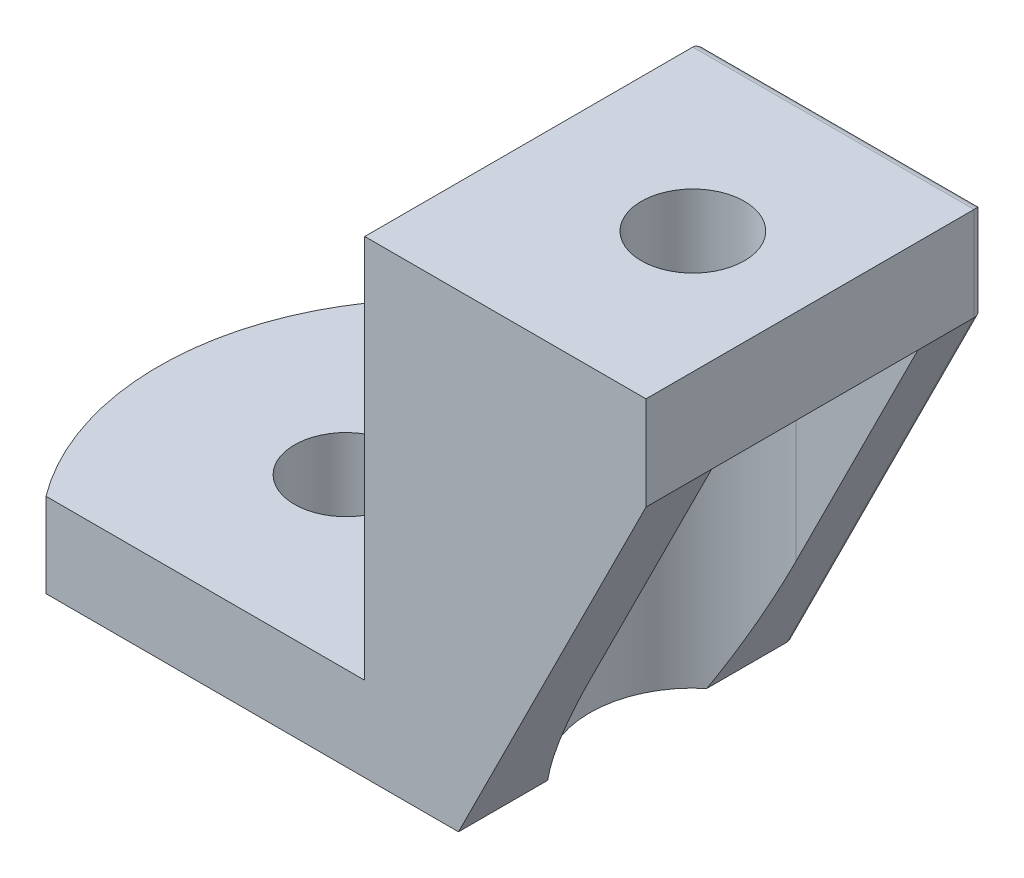
ISO-10303-21;
HEADER;
FILE_DESCRIPTION(('STEP AP214'),'2;1');
FILE_NAME('part.step','',(''),(''),'','','');
FILE_SCHEMA(('AUTOMOTIVE_DESIGN { 1 0 10303 214 1 1 1 1 }'));
ENDSEC;
DATA;
#1=APPLICATION_CONTEXT('core data for automotive mechanical design processes');
#2=APPLICATION_PROTOCOL_DEFINITION('international standard','automotive_design',2000,#1);
#3=PRODUCT_CONTEXT('',#1,'mechanical');
#4=PRODUCT('Part','Part','',(#3));
#5=PRODUCT_RELATED_PRODUCT_CATEGORY('part','',(#4));
#6=PRODUCT_DEFINITION_FORMATION('','',#4);
#7=PRODUCT_DEFINITION_CONTEXT('part definition',#1,'design');
#8=PRODUCT_DEFINITION('design','',#6,#7);
#9=PRODUCT_DEFINITION_SHAPE('','',#8);
#10=(LENGTH_UNIT() NAMED_UNIT(*) SI_UNIT(.MILLI.,.METRE.));
#11=(NAMED_UNIT(*) PLANE_ANGLE_UNIT() SI_UNIT($,.RADIAN.));
#12=(NAMED_UNIT(*) SI_UNIT($,.STERADIAN.) SOLID_ANGLE_UNIT());
#13=UNCERTAINTY_MEASURE_WITH_UNIT(LENGTH_MEASURE(1.E-05),#10,'distance_accuracy_value','');
#14=(GEOMETRIC_REPRESENTATION_CONTEXT(3) GLOBAL_UNCERTAINTY_ASSIGNED_CONTEXT((#13)) GLOBAL_UNIT_ASSIGNED_CONTEXT((#10,
#11,#12)) REPRESENTATION_CONTEXT('',''));
#15=CARTESIAN_POINT('',(0.,0.,0.));
#16=DIRECTION('',(0.,0.,1.));
#17=DIRECTION('',(1.,0.,0.));
#18=AXIS2_PLACEMENT_3D('',#15,#16,#17);
#19=CARTESIAN_POINT('',(0.,0.,0.));
#20=DIRECTION('',(0.,-1.,0.));
#21=DIRECTION('',(-1.,0.,0.));
#22=AXIS2_PLACEMENT_3D('',#19,#20,#21);
#23=PLANE('',#22);
#24=CARTESIAN_POINT('',(-5.00000000001,0.,9.00000000001));
#25=DIRECTION('',(0.,-1.,6.66888711271147E-13));
#26=DIRECTION('',(1.,0.,0.));
#27=AXIS2_PLACEMENT_3D('',#24,#25,#26);
#28=CIRCLE('',#27,15.00000000001);
#29=CARTESIAN_POINT('',(-17.,0.,18.));
#30=VERTEX_POINT('',#29);
#31=CARTESIAN_POINT('',(-17.3592070943,0.,0.5));
#32=VERTEX_POINT('',#31);
#33=EDGE_CURVE('E197',#30,#32,#28,.T.);
#34=ORIENTED_EDGE('',*,*,#33,.F.);
#35=DIRECTION('',(-1.,1.0000001517783E-11,0.));
#36=VECTOR('',#35,1.);
#37=CARTESIAN_POINT('',(0.,0.,18.00000000001));
#38=LINE('',#37,#36);
#39=CARTESIAN_POINT('',(0.,0.,18.));
#40=VERTEX_POINT('',#39);
#41=EDGE_CURVE('E43',#40,#30,#38,.T.);
#42=ORIENTED_EDGE('',*,*,#41,.F.);
#43=DIRECTION('',(0.,0.,1.));
#44=VECTOR('',#43,1.);
#45=CARTESIAN_POINT('',(0.,0.,0.));
#46=LINE('',#45,#44);
#47=CARTESIAN_POINT('',(0.,0.,0.5));
#48=VERTEX_POINT('',#47);
#49=EDGE_CURVE('E317',#48,#40,#46,.T.);
#50=ORIENTED_EDGE('',*,*,#49,.F.);
#51=DIRECTION('',(-1.,1.0000001517783E-11,0.));
#52=VECTOR('',#51,1.);
#53=CARTESIAN_POINT('',(1.E-11,1.00001110223025E-11,0.50000000001));
#54=LINE('',#53,#52);
#55=EDGE_CURVE('E11',#48,#32,#54,.T.);
#56=ORIENTED_EDGE('',*,*,#55,.T.);
#57=EDGE_LOOP('',(#34,#42,#50,#56));
#58=FACE_BOUND('',#57,.T.);
#59=CARTESIAN_POINT('',(-10.00000000001,0.,9.00000000001));
#60=DIRECTION('',(0.,-1.,3.63658568095534E-12));
#61=DIRECTION('',(1.,0.,0.));
#62=AXIS2_PLACEMENT_3D('',#59,#60,#61);
#63=CIRCLE('',#62,2.75000000001);
#64=CARTESIAN_POINT('',(-7.25,0.,9.00000000001));
#65=VERTEX_POINT('',#64);
#66=EDGE_CURVE('E28',#65,#65,#63,.T.);
#67=ORIENTED_EDGE('',*,*,#66,.T.);
#68=EDGE_LOOP('',(#67));
#69=FACE_BOUND('',#68,.T.);
#70=ADVANCED_FACE('F17',(#58,#69),#23,.F.);
#71=CARTESIAN_POINT('',(-5.,-4.5,9.));
#72=DIRECTION('',(0.,-1.,0.));
#73=DIRECTION('',(1.,0.,0.));
#74=AXIS2_PLACEMENT_3D('',#71,#72,#73);
#75=CYLINDRICAL_SURFACE('',#74,15.);
#76=CARTESIAN_POINT('',(-5.00000000001,-4.50000000001,9.00000000001));
#77=DIRECTION('',(0.,-1.,6.66888711271147E-13));
#78=DIRECTION('',(1.,0.,0.));
#79=AXIS2_PLACEMENT_3D('',#76,#77,#78);
#80=CIRCLE('',#79,15.00000000001);
#81=CARTESIAN_POINT('',(-17.,-4.5,18.));
#82=VERTEX_POINT('',#81);
#83=CARTESIAN_POINT('',(-17.3592070943,-4.5,0.5));
#84=VERTEX_POINT('',#83);
#85=EDGE_CURVE('E218',#82,#84,#80,.T.);
#86=ORIENTED_EDGE('',*,*,#85,.F.);
#87=DIRECTION('',(0.,1.,-1.00002220445049E-11));
#88=VECTOR('',#87,1.);
#89=CARTESIAN_POINT('',(-17.00000000001,-4.50000000001,18.00000000001));
#90=LINE('',#89,#88);
#91=EDGE_CURVE('E192',#82,#30,#90,.T.);
#92=ORIENTED_EDGE('',*,*,#91,.T.);
#93=ORIENTED_EDGE('',*,*,#33,.T.);
#94=CARTESIAN_POINT('',(-17.15242081842,-0.09491930606274,0.206896551734));
#95=CARTESIAN_POINT('',(-17.17545216604,-0.07188795844802,0.238726795729));
#96=CARTESIAN_POINT('',(-17.2015156202,-0.05074090276755,0.274983152544));
#97=CARTESIAN_POINT('',(-17.23155530229,-0.03186469501301,0.317104944843));
#98=CARTESIAN_POINT('',(-17.2873544218,-0.009856424986612,0.396379890859));
#99=CARTESIAN_POINT('',(-17.31026091638,-0.003416446063638,0.429127817203));
#100=CARTESIAN_POINT('',(-17.3347654108,-3.18807745398E-09,0.464461196963));
#101=CARTESIAN_POINT('',(-17.35920709431,-1.00008326672685E-11,0.50000000001));
#102=B_SPLINE_CURVE_WITH_KNOTS('',4,(#94,#95,#96,#97,#98,#99,#100,#101),.UNSPECIFIED.,.F.,.F.,
(5,3,5),(0.,0.619917444854,1.),.UNSPECIFIED.);
#103=CARTESIAN_POINT('',(-17.15242081841,-0.09491930605274,0.206896551724));
#104=VERTEX_POINT('',#103);
#105=EDGE_CURVE('E346',#104,#32,#102,.T.);
#106=ORIENTED_EDGE('',*,*,#105,.F.);
#107=DIRECTION('',(0.,1.,-1.00002220445049E-11));
#108=VECTOR('',#107,1.);
#109=CARTESIAN_POINT('',(-17.15242081842,-4.50000000001,0.206896551734));
#110=LINE('',#109,#108);
#111=CARTESIAN_POINT('',(-17.15242081841,-4.405080693947,0.206896551724));
#112=VERTEX_POINT('',#111);
#113=EDGE_CURVE('E160',#112,#104,#110,.T.);
#114=ORIENTED_EDGE('',*,*,#113,.F.);
#115=CARTESIAN_POINT('',(-17.15242081842,-4.405080693957,0.206896551734));
#116=CARTESIAN_POINT('',(-17.17545216604,-4.428112041572,0.238726795729));
#117=CARTESIAN_POINT('',(-17.2015156202,-4.449259097252,0.274983152544));
#118=CARTESIAN_POINT('',(-17.23155530229,-4.468135305007,0.317104944843));
#119=CARTESIAN_POINT('',(-17.2873544218,-4.490143575033,0.396379890859));
#120=CARTESIAN_POINT('',(-17.31026091638,-4.496583553956,0.429127817203));
#121=CARTESIAN_POINT('',(-17.3347654108,-4.499999996832,0.464461196963));
#122=CARTESIAN_POINT('',(-17.35920709431,-4.50000000001,0.50000000001));
#123=B_SPLINE_CURVE_WITH_KNOTS('',4,(#115,#116,#117,#118,#119,#120,#121,#122),.UNSPECIFIED.,.F.,
.F.,(5,3,5),(0.,0.619917444854,1.),.UNSPECIFIED.);
#124=EDGE_CURVE('E155',#112,#84,#123,.T.);
#125=ORIENTED_EDGE('',*,*,#124,.T.);
#126=EDGE_LOOP('',(#86,#92,#93,#106,#114,#125));
#127=FACE_BOUND('',#126,.T.);
#128=ADVANCED_FACE('F683',(#127),#75,.T.);
#129=CARTESIAN_POINT('',(0.,-0.5,0.5));
#130=DIRECTION('',(-1.,0.,0.));
#131=DIRECTION('',(0.,1.,0.));
#132=AXIS2_PLACEMENT_3D('',#129,#130,#131);
#133=CYLINDRICAL_SURFACE('',#132,0.5);
#134=CARTESIAN_POINT('',(-16.74734012448,-0.50000000001,0.50000000001));
#135=DIRECTION('',(0.707106781186548,0.707106781186548,-1.4142292632694E-11));
#136=DIRECTION('',(-0.707106781186548,0.707106781186548,-1.41422926326849E-11));
#137=AXIS2_PLACEMENT_3D('',#134,#135,#136);
#138=ELLIPSE('',#137,0.707106781201142,0.50000000001);
#139=CARTESIAN_POINT('',(-16.74734012447,-0.5,0.));
#140=VERTEX_POINT('',#139);
#141=EDGE_CURVE('E174',#140,#104,#138,.T.);
#142=ORIENTED_EDGE('',*,*,#141,.T.);
#143=ORIENTED_EDGE('',*,*,#105,.T.);
#144=ORIENTED_EDGE('',*,*,#55,.F.);
#145=CARTESIAN_POINT('',(0.50000000001,-0.50000000001,0.50000000001));
#146=DIRECTION('',(-0.707106781186548,-0.707106781186548,0.));
#147=DIRECTION('',(-0.707106781186548,0.707106781186548,0.));
#148=AXIS2_PLACEMENT_3D('',#145,#146,#147);
#149=ELLIPSE('',#148,0.707106781201142,0.50000000001);
#150=CARTESIAN_POINT('',(0.5,-0.5,0.));
#151=VERTEX_POINT('',#150);
#152=EDGE_CURVE('E325',#48,#151,#149,.T.);
#153=ORIENTED_EDGE('',*,*,#152,.T.);
#154=DIRECTION('',(-1.,1.0000001517783E-11,0.));
#155=VECTOR('',#154,1.);
#156=CARTESIAN_POINT('',(-1.00000007589415E-11,-0.50000000001,-1.00001110223025E-11));
#157=LINE('',#156,#155);
#158=EDGE_CURVE('E196',#151,#140,#157,.T.);
#159=ORIENTED_EDGE('',*,*,#158,.T.);
#160=EDGE_LOOP('',(#142,#143,#144,#153,#159));
#161=FACE_BOUND('',#160,.T.);
#162=ADVANCED_FACE('F674',(#161),#133,.T.);
#163=CARTESIAN_POINT('',(0.,20.5,0.));
#164=DIRECTION('',(1.,0.,0.));
#165=DIRECTION('',(0.,1.,0.));
#166=AXIS2_PLACEMENT_3D('',#163,#164,#165);
#167=PLANE('',#166);
#168=DIRECTION('',(0.,-1.,0.));
#169=VECTOR('',#168,1.);
#170=CARTESIAN_POINT('',(-1.00001110223025E-11,20.50000000001,0.50000000001));
#171=LINE('',#170,#169);
#172=CARTESIAN_POINT('',(0.,20.5,0.5));
#173=VERTEX_POINT('',#172);
#174=EDGE_CURVE('E321',#173,#48,#171,.T.);
#175=ORIENTED_EDGE('',*,*,#174,.T.);
#176=ORIENTED_EDGE('',*,*,#49,.T.);
#177=DIRECTION('',(0.,-1.,0.));
#178=VECTOR('',#177,1.);
#179=CARTESIAN_POINT('',(0.,20.50000000001,18.00000000001));
#180=LINE('',#179,#178);
#181=CARTESIAN_POINT('',(0.,20.5,18.));
#182=VERTEX_POINT('',#181);
#183=EDGE_CURVE('E253',#182,#40,#180,.T.);
#184=ORIENTED_EDGE('',*,*,#183,.F.);
#185=DIRECTION('',(0.,0.,1.));
#186=VECTOR('',#185,1.);
#187=CARTESIAN_POINT('',(0.,20.50000000001,0.));
#188=LINE('',#187,#186);
#189=EDGE_CURVE('E362',#173,#182,#188,.T.);
#190=ORIENTED_EDGE('',*,*,#189,.F.);
#191=EDGE_LOOP('',(#175,#176,#184,#190));
#192=FACE_BOUND('',#191,.T.);
#193=ADVANCED_FACE('F422',(#192),#167,.F.);
#194=CARTESIAN_POINT('',(0.,0.,18.));
#195=DIRECTION('',(0.,0.,-1.));
#196=DIRECTION('',(0.,-1.,0.));
#197=AXIS2_PLACEMENT_3D('',#194,#195,#196);
#198=PLANE('',#197);
#199=ORIENTED_EDGE('',*,*,#91,.F.);
#200=DIRECTION('',(1.,0.,0.));
#201=VECTOR('',#200,1.);
#202=CARTESIAN_POINT('',(-20.00000000001,-4.50000000001,18.00000000001));
#203=LINE('',#202,#201);
#204=CARTESIAN_POINT('',(5.,-4.5,18.));
#205=VERTEX_POINT('',#204);
#206=EDGE_CURVE('E322',#82,#205,#203,.T.);
#207=ORIENTED_EDGE('',*,*,#206,.T.);
#208=DIRECTION('',(0.447213595503958,0.894427190997916,0.));
#209=VECTOR('',#208,1.);
#210=CARTESIAN_POINT('',(5.00000000001,-4.50000000001,18.00000000001));
#211=LINE('',#210,#209);
#212=CARTESIAN_POINT('',(15.,15.5,18.));
#213=VERTEX_POINT('',#212);
#214=EDGE_CURVE('E357',#205,#213,#211,.T.);
#215=ORIENTED_EDGE('',*,*,#214,.T.);
#216=DIRECTION('',(0.,1.,0.));
#217=VECTOR('',#216,1.);
#218=CARTESIAN_POINT('',(15.00000000001,15.50000000001,18.00000000001));
#219=LINE('',#218,#217);
#220=CARTESIAN_POINT('',(15.,20.5,18.));
#221=VERTEX_POINT('',#220);
#222=EDGE_CURVE('E360',#213,#221,#219,.T.);
#223=ORIENTED_EDGE('',*,*,#222,.T.);
#224=DIRECTION('',(-1.,0.,0.));
#225=VECTOR('',#224,1.);
#226=CARTESIAN_POINT('',(15.00000000001,20.50000000001,18.00000000001));
#227=LINE('',#226,#225);
#228=EDGE_CURVE('E369',#221,#182,#227,.T.);
#229=ORIENTED_EDGE('',*,*,#228,.T.);
#230=ORIENTED_EDGE('',*,*,#183,.T.);
#231=ORIENTED_EDGE('',*,*,#41,.T.);
#232=EDGE_LOOP('',(#199,#207,#215,#223,#229,#230,#231));
#233=FACE_BOUND('',#232,.T.);
#234=ADVANCED_FACE('F655',(#233),#198,.F.);
#235=CARTESIAN_POINT('',(-10.,-4.5,9.));
#236=DIRECTION('',(0.,-1.,0.));
#237=DIRECTION('',(1.,0.,0.));
#238=AXIS2_PLACEMENT_3D('',#235,#236,#237);
#239=CYLINDRICAL_SURFACE('',#238,2.75);
#240=ORIENTED_EDGE('',*,*,#66,.F.);
#241=EDGE_LOOP('',(#240));
#242=FACE_BOUND('',#241,.T.);
#243=CARTESIAN_POINT('',(-10.00000000001,-4.50000000001,9.00000000001));
#244=DIRECTION('',(0.,-1.,3.63658568095534E-12));
#245=DIRECTION('',(1.,0.,0.));
#246=AXIS2_PLACEMENT_3D('',#243,#244,#245);
#247=CIRCLE('',#246,2.75000000001);
#248=CARTESIAN_POINT('',(-7.25,-4.50000000001,9.00000000001));
#249=VERTEX_POINT('',#248);
#250=EDGE_CURVE('E239',#249,#249,#247,.T.);
#251=ORIENTED_EDGE('',*,*,#250,.T.);
#252=EDGE_LOOP('',(#251));
#253=FACE_BOUND('',#252,.T.);
#254=ADVANCED_FACE('F646',(#242,#253),#239,.F.);
#255=CARTESIAN_POINT('',(-20.,-4.5,0.));
#256=DIRECTION('',(0.,1.,0.));
#257=DIRECTION('',(1.,0.,0.));
#258=AXIS2_PLACEMENT_3D('',#255,#256,#257);
#259=PLANE('',#258);
#260=CARTESIAN_POINT('',(8.50000000001,-4.50000000001,9.00000000001));
#261=DIRECTION('',(0.,-1.,1.81840386278343E-12));
#262=DIRECTION('',(1.,0.,0.));
#263=AXIS2_PLACEMENT_3D('',#260,#261,#262);
#264=CIRCLE('',#263,5.50000000001);
#265=CARTESIAN_POINT('',(5.,-4.5,13.242640687119));
#266=VERTEX_POINT('',#265);
#267=CARTESIAN_POINT('',(5.000000000001,-4.5,4.75735931288));
#268=VERTEX_POINT('',#267);
#269=EDGE_CURVE('E269',#266,#268,#264,.T.);
#270=ORIENTED_EDGE('',*,*,#269,.F.);
#271=DIRECTION('',(0.,0.,1.));
#272=VECTOR('',#271,1.);
#273=CARTESIAN_POINT('',(5.00000000001,-4.50000000001,0.));
#274=LINE('',#273,#272);
#275=EDGE_CURVE('E227',#266,#205,#274,.T.);
#276=ORIENTED_EDGE('',*,*,#275,.T.);
#277=ORIENTED_EDGE('',*,*,#206,.F.);
#278=ORIENTED_EDGE('',*,*,#85,.T.);
#279=DIRECTION('',(1.,0.,0.));
#280=VECTOR('',#279,1.);
#281=CARTESIAN_POINT('',(-17.00000000001,-4.50000000001,0.50000000001));
#282=LINE('',#281,#280);
#283=CARTESIAN_POINT('',(5.,-4.5,0.5));
#284=VERTEX_POINT('',#283);
#285=EDGE_CURVE('E215',#84,#284,#282,.T.);
#286=ORIENTED_EDGE('',*,*,#285,.T.);
#287=EDGE_CURVE('E169',#284,#268,#274,.T.);
#288=ORIENTED_EDGE('',*,*,#287,.T.);
#289=EDGE_LOOP('',(#270,#276,#277,#278,#286,#288));
#290=FACE_BOUND('',#289,.T.);
#291=ORIENTED_EDGE('',*,*,#250,.F.);
#292=EDGE_LOOP('',(#291));
#293=FACE_BOUND('',#292,.T.);
#294=ADVANCED_FACE('F637',(#290,#293),#259,.F.);
#295=CARTESIAN_POINT('',(-17.,-4.,0.5));
#296=DIRECTION('',(1.,0.,0.));
#297=DIRECTION('',(0.,0.,-1.));
#298=AXIS2_PLACEMENT_3D('',#295,#296,#297);
#299=CYLINDRICAL_SURFACE('',#298,0.5);
#300=DIRECTION('',(1.,0.,0.));
#301=VECTOR('',#300,1.);
#302=CARTESIAN_POINT('',(-17.00000000001,-4.00000000001,-1.00001110223025E-11));
#303=LINE('',#302,#301);
#304=CARTESIAN_POINT('',(-16.74734012447,-4.,0.));
#305=VERTEX_POINT('',#304);
#306=CARTESIAN_POINT('',(4.690983005625,-4.,0.));
#307=VERTEX_POINT('',#306);
#308=EDGE_CURVE('E151',#305,#307,#303,.T.);
#309=ORIENTED_EDGE('',*,*,#308,.T.);
#310=CARTESIAN_POINT('',(4.690983005635,-4.00000000001,0.50000000001));
#311=DIRECTION('',(-0.850650808349183,-0.525731112123757,0.));
#312=DIRECTION('',(0.525731112123757,-0.850650808349182,0.));
#313=AXIS2_PLACEMENT_3D('',#310,#311,#312);
#314=ELLIPSE('',#313,0.587785252305764,0.50000000001);
#315=EDGE_CURVE('E159',#307,#284,#314,.T.);
#316=ORIENTED_EDGE('',*,*,#315,.T.);
#317=ORIENTED_EDGE('',*,*,#285,.F.);
#318=ORIENTED_EDGE('',*,*,#124,.F.);
#319=CARTESIAN_POINT('',(-16.74734012448,-4.00000000001,0.50000000001));
#320=DIRECTION('',(-0.707106781186548,0.707106781186548,-1.4142292632694E-11));
#321=DIRECTION('',(0.707106781186548,0.707106781186548,-1.41422926326849E-11));
#322=AXIS2_PLACEMENT_3D('',#319,#320,#321);
#323=ELLIPSE('',#322,0.707106781201142,0.50000000001);
#324=EDGE_CURVE('E148',#305,#112,#323,.T.);
#325=ORIENTED_EDGE('',*,*,#324,.F.);
#326=EDGE_LOOP('',(#309,#316,#317,#318,#325));
#327=FACE_BOUND('',#326,.T.);
#328=ADVANCED_FACE('F150',(#327),#299,.T.);
#329=CARTESIAN_POINT('',(-16.74734012447,-4.5,0.5));
#330=DIRECTION('',(0.,1.,0.));
#331=DIRECTION('',(0.,0.,-1.));
#332=AXIS2_PLACEMENT_3D('',#329,#330,#331);
#333=CYLINDRICAL_SURFACE('',#332,0.5);
#334=ORIENTED_EDGE('',*,*,#324,.T.);
#335=ORIENTED_EDGE('',*,*,#113,.T.);
#336=ORIENTED_EDGE('',*,*,#141,.F.);
#337=DIRECTION('',(0.,1.,-1.00002220445049E-11));
#338=VECTOR('',#337,1.);
#339=CARTESIAN_POINT('',(-16.74734012448,-4.50000000001,0.));
#340=LINE('',#339,#338);
#341=EDGE_CURVE('E166',#305,#140,#340,.T.);
#342=ORIENTED_EDGE('',*,*,#341,.F.);
#343=EDGE_LOOP('',(#334,#335,#336,#342));
#344=FACE_BOUND('',#343,.T.);
#345=ADVANCED_FACE('F172',(#344),#333,.T.);
#346=CARTESIAN_POINT('',(0.,0.,0.));
#347=DIRECTION('',(0.,0.,-1.));
#348=DIRECTION('',(0.,-1.,0.));
#349=AXIS2_PLACEMENT_3D('',#346,#347,#348);
#350=PLANE('',#349);
#351=ORIENTED_EDGE('',*,*,#158,.F.);
#352=DIRECTION('',(0.,-1.,0.));
#353=VECTOR('',#352,1.);
#354=CARTESIAN_POINT('',(0.50000000001,20.50000000001,-1.00001110223025E-11));
#355=LINE('',#354,#353);
#356=CARTESIAN_POINT('',(0.5,20.,0.));
#357=VERTEX_POINT('',#356);
#358=EDGE_CURVE('E176',#357,#151,#355,.T.);
#359=ORIENTED_EDGE('',*,*,#358,.F.);
#360=DIRECTION('',(-1.,0.,0.));
#361=VECTOR('',#360,1.);
#362=CARTESIAN_POINT('',(15.00000000001,20.00000000001,-1.00001110223025E-11));
#363=LINE('',#362,#361);
#364=CARTESIAN_POINT('',(14.5,20.,0.));
#365=VERTEX_POINT('',#364);
#366=EDGE_CURVE('E326',#365,#357,#363,.T.);
#367=ORIENTED_EDGE('',*,*,#366,.F.);
#368=DIRECTION('',(0.,1.,0.));
#369=VECTOR('',#368,1.);
#370=CARTESIAN_POINT('',(14.50000000001,15.50000000001,-1.00001110223025E-11));
#371=LINE('',#370,#369);
#372=CARTESIAN_POINT('',(14.5,15.61803398875,0.));
#373=VERTEX_POINT('',#372);
#374=EDGE_CURVE('E207',#373,#365,#371,.T.);
#375=ORIENTED_EDGE('',*,*,#374,.F.);
#376=DIRECTION('',(0.447213595503958,0.894427190997916,0.));
#377=VECTOR('',#376,1.);
#378=CARTESIAN_POINT('',(4.55278640451,-4.27639320226,-1.00001110223025E-11));
#379=LINE('',#378,#377);
#380=EDGE_CURVE('E168',#307,#373,#379,.T.);
#381=ORIENTED_EDGE('',*,*,#380,.F.);
#382=ORIENTED_EDGE('',*,*,#308,.F.);
#383=ORIENTED_EDGE('',*,*,#341,.T.);
#384=EDGE_LOOP('',(#351,#359,#367,#375,#381,#382,#383));
#385=FACE_BOUND('',#384,.T.);
#386=ADVANCED_FACE('F165',(#385),#350,.T.);
#387=CARTESIAN_POINT('',(0.5,20.5,0.5));
#388=DIRECTION('',(0.,-1.,0.));
#389=DIRECTION('',(0.,0.,-1.));
#390=AXIS2_PLACEMENT_3D('',#387,#388,#389);
#391=CYLINDRICAL_SURFACE('',#390,0.5);
#392=ORIENTED_EDGE('',*,*,#358,.T.);
#393=ORIENTED_EDGE('',*,*,#152,.F.);
#394=ORIENTED_EDGE('',*,*,#174,.F.);
#395=CARTESIAN_POINT('',(0.50000000001,20.00000000001,0.50000000001));
#396=DIRECTION('',(0.707106781186548,0.707106781186548,0.));
#397=DIRECTION('',(-0.707106781186548,0.707106781186548,0.));
#398=AXIS2_PLACEMENT_3D('',#395,#396,#397);
#399=ELLIPSE('',#398,0.707106781201142,0.50000000001);
#400=EDGE_CURVE('E210',#357,#173,#399,.T.);
#401=ORIENTED_EDGE('',*,*,#400,.F.);
#402=EDGE_LOOP('',(#392,#393,#394,#401));
#403=FACE_BOUND('',#402,.T.);
#404=ADVANCED_FACE('F424',(#403),#391,.T.);
#405=CARTESIAN_POINT('',(15.,20.5,0.));
#406=DIRECTION('',(0.,-1.,0.));
#407=DIRECTION('',(0.,0.,-1.));
#408=AXIS2_PLACEMENT_3D('',#405,#406,#407);
#409=PLANE('',#408);
#410=DIRECTION('',(-1.,0.,0.));
#411=VECTOR('',#410,1.);
#412=CARTESIAN_POINT('',(15.00000000001,20.50000000001,0.50000000001));
#413=LINE('',#412,#411);
#414=CARTESIAN_POINT('',(15.,20.5,0.5));
#415=VERTEX_POINT('',#414);
#416=EDGE_CURVE('E186',#415,#173,#413,.T.);
#417=ORIENTED_EDGE('',*,*,#416,.T.);
#418=ORIENTED_EDGE('',*,*,#189,.T.);
#419=ORIENTED_EDGE('',*,*,#228,.F.);
#420=DIRECTION('',(0.,0.,1.));
#421=VECTOR('',#420,1.);
#422=CARTESIAN_POINT('',(15.00000000001,20.50000000001,0.));
#423=LINE('',#422,#421);
#424=EDGE_CURVE('E267',#415,#221,#423,.T.);
#425=ORIENTED_EDGE('',*,*,#424,.F.);
#426=EDGE_LOOP('',(#417,#418,#419,#425));
#427=FACE_BOUND('',#426,.T.);
#428=CARTESIAN_POINT('',(8.50000000001,20.50000000001,9.00000000001));
#429=DIRECTION('',(3.63645687091813E-12,-1.,3.63658568096856E-12));
#430=DIRECTION('',(1.,3.6364568709049E-12,-3.63636363635041E-12));
#431=AXIS2_PLACEMENT_3D('',#428,#429,#430);
#432=CIRCLE('',#431,2.75000000001);
#433=CARTESIAN_POINT('',(11.25000000002,20.50000000002,9.));
#434=VERTEX_POINT('',#433);
#435=EDGE_CURVE('E365',#434,#434,#432,.T.);
#436=ORIENTED_EDGE('',*,*,#435,.T.);
#437=EDGE_LOOP('',(#436));
#438=FACE_BOUND('',#437,.T.);
#439=ADVANCED_FACE('F19',(#427,#438),#409,.F.);
#440=CARTESIAN_POINT('',(5.,-4.5,0.));
#441=DIRECTION('',(-0.894427190999916,0.447213595499958,0.));
#442=DIRECTION('',(0.,0.,1.));
#443=AXIS2_PLACEMENT_3D('',#440,#441,#442);
#444=PLANE('',#443);
#445=DIRECTION('',(0.447213595503958,0.894427190997916,-1.00001986025981E-11));
#446=VECTOR('',#445,1.);
#447=CARTESIAN_POINT('',(6.00000000001,-2.50000000001,14.50000000001));
#448=LINE('',#447,#446);
#449=CARTESIAN_POINT('',(8.5,2.5,14.5));
#450=VERTEX_POINT('',#449);
#451=CARTESIAN_POINT('',(15.,15.5,14.5));
#452=VERTEX_POINT('',#451);
#453=EDGE_CURVE('E190',#450,#452,#448,.T.);
#454=ORIENTED_EDGE('',*,*,#453,.T.);
#455=DIRECTION('',(0.,0.,1.));
#456=VECTOR('',#455,1.);
#457=CARTESIAN_POINT('',(15.00000000001,15.50000000001,0.));
#458=LINE('',#457,#456);
#459=EDGE_CURVE('E201',#452,#213,#458,.T.);
#460=ORIENTED_EDGE('',*,*,#459,.T.);
#461=ORIENTED_EDGE('',*,*,#214,.F.);
#462=ORIENTED_EDGE('',*,*,#275,.F.);
#463=CARTESIAN_POINT('',(8.50000000001,2.50000000001,9.00000000001));
#464=DIRECTION('',(-0.894427190999753,0.447213595500283,8.13115628179376E-13));
#465=DIRECTION('',(-0.447213595500283,-0.894427190999753,8.13363881596169E-13));
#466=AXIS2_PLACEMENT_3D('',#463,#464,#465);
#467=ELLIPSE('',#466,12.2983738762624,5.50000000001);
#468=EDGE_CURVE('E198',#266,#450,#467,.T.);
#469=ORIENTED_EDGE('',*,*,#468,.T.);
#470=EDGE_LOOP('',(#454,#460,#461,#462,#469));
#471=FACE_BOUND('',#470,.T.);
#472=ADVANCED_FACE('F580',(#471),#444,.F.);
#473=CARTESIAN_POINT('',(15.,15.5,0.));
#474=DIRECTION('',(-1.,0.,0.));
#475=DIRECTION('',(0.,0.,1.));
#476=AXIS2_PLACEMENT_3D('',#473,#474,#475);
#477=PLANE('',#476);
#478=DIRECTION('',(0.,1.,0.));
#479=VECTOR('',#478,1.);
#480=CARTESIAN_POINT('',(15.00000000001,15.50000000001,0.50000000001));
#481=LINE('',#480,#479);
#482=CARTESIAN_POINT('',(15.,15.5,0.5));
#483=VERTEX_POINT('',#482);
#484=EDGE_CURVE('E202',#483,#415,#481,.T.);
#485=ORIENTED_EDGE('',*,*,#484,.T.);
#486=ORIENTED_EDGE('',*,*,#424,.T.);
#487=ORIENTED_EDGE('',*,*,#222,.F.);
#488=ORIENTED_EDGE('',*,*,#459,.F.);
#489=CARTESIAN_POINT('',(15.,15.5,3.5));
#490=VERTEX_POINT('',#489);
#491=EDGE_CURVE('E271',#490,#452,#458,.T.);
#492=ORIENTED_EDGE('',*,*,#491,.F.);
#493=EDGE_CURVE('E259',#483,#490,#458,.T.);
#494=ORIENTED_EDGE('',*,*,#493,.F.);
#495=EDGE_LOOP('',(#485,#486,#487,#488,#492,#494));
#496=FACE_BOUND('',#495,.T.);
#497=ADVANCED_FACE('F433',(#496),#477,.F.);
#498=DIRECTION('',(0.447213595503958,0.894427190997916,-1.00001986025981E-11));
#499=VECTOR('',#498,1.);
#500=CARTESIAN_POINT('',(6.00000000001,-2.50000000001,3.50000000001));
#501=LINE('',#500,#499);
#502=CARTESIAN_POINT('',(8.5,2.5,3.5));
#503=VERTEX_POINT('',#502);
#504=EDGE_CURVE('E285',#503,#490,#501,.T.);
#505=ORIENTED_EDGE('',*,*,#504,.F.);
#506=EDGE_CURVE('E203',#503,#268,#467,.T.);
#507=ORIENTED_EDGE('',*,*,#506,.T.);
#508=ORIENTED_EDGE('',*,*,#287,.F.);
#509=DIRECTION('',(0.447213595503958,0.894427190997916,0.));
#510=VECTOR('',#509,1.);
#511=CARTESIAN_POINT('',(5.00000000001,-4.50000000001,0.50000000001));
#512=LINE('',#511,#510);
#513=EDGE_CURVE('E256',#284,#483,#512,.T.);
#514=ORIENTED_EDGE('',*,*,#513,.T.);
#515=ORIENTED_EDGE('',*,*,#493,.T.);
#516=EDGE_LOOP('',(#505,#507,#508,#514,#515));
#517=FACE_BOUND('',#516,.T.);
#518=ADVANCED_FACE('F569',(#517),#444,.F.);
#519=CARTESIAN_POINT('',(8.5,-4.5,9.));
#520=DIRECTION('',(0.,-1.,0.));
#521=DIRECTION('',(1.,0.,0.));
#522=AXIS2_PLACEMENT_3D('',#519,#520,#521);
#523=CYLINDRICAL_SURFACE('',#522,5.5);
#524=ORIENTED_EDGE('',*,*,#269,.T.);
#525=ORIENTED_EDGE('',*,*,#506,.F.);
#526=DIRECTION('',(0.,1.,-1.00002220445049E-11));
#527=VECTOR('',#526,1.);
#528=CARTESIAN_POINT('',(8.50000000001,-4.50000000001,3.50000000001));
#529=LINE('',#528,#527);
#530=CARTESIAN_POINT('',(8.5,15.5,3.5));
#531=VERTEX_POINT('',#530);
#532=EDGE_CURVE('E206',#503,#531,#529,.T.);
#533=ORIENTED_EDGE('',*,*,#532,.T.);
#534=CARTESIAN_POINT('',(8.50000000001,15.50000000001,9.00000000001));
#535=DIRECTION('',(0.,-1.,1.81840386278343E-12));
#536=DIRECTION('',(1.,0.,0.));
#537=AXIS2_PLACEMENT_3D('',#534,#535,#536);
#538=CIRCLE('',#537,5.50000000001);
#539=CARTESIAN_POINT('',(8.5,15.5,14.5));
#540=VERTEX_POINT('',#539);
#541=EDGE_CURVE('E284',#540,#531,#538,.T.);
#542=ORIENTED_EDGE('',*,*,#541,.F.);
#543=DIRECTION('',(0.,1.,-1.00002220445049E-11));
#544=VECTOR('',#543,1.);
#545=CARTESIAN_POINT('',(8.50000000001,-4.50000000001,14.50000000001));
#546=LINE('',#545,#544);
#547=EDGE_CURVE('E310',#450,#540,#546,.T.);
#548=ORIENTED_EDGE('',*,*,#547,.F.);
#549=ORIENTED_EDGE('',*,*,#468,.F.);
#550=EDGE_LOOP('',(#524,#525,#533,#542,#548,#549));
#551=FACE_BOUND('',#550,.T.);
#552=ADVANCED_FACE('F560',(#551),#523,.F.);
#553=CARTESIAN_POINT('',(4.5527864045,-4.27639320225,0.5));
#554=DIRECTION('',(0.447213595499958,0.894427190999916,0.));
#555=DIRECTION('',(0.,0.,-1.));
#556=AXIS2_PLACEMENT_3D('',#553,#554,#555);
#557=CYLINDRICAL_SURFACE('',#556,0.5);
#558=ORIENTED_EDGE('',*,*,#380,.T.);
#559=CARTESIAN_POINT('',(14.50000000001,15.61803398876,0.50000000001));
#560=DIRECTION('',(-0.229752920561043,-0.9732489894645,0.));
#561=DIRECTION('',(0.9732489894645,-0.229752920561043,0.));
#562=AXIS2_PLACEMENT_3D('',#559,#560,#561);
#563=ELLIPSE('',#562,0.51374314838503,0.50000000001);
#564=EDGE_CURVE('E21',#373,#483,#563,.T.);
#565=ORIENTED_EDGE('',*,*,#564,.T.);
#566=ORIENTED_EDGE('',*,*,#513,.F.);
#567=ORIENTED_EDGE('',*,*,#315,.F.);
#568=EDGE_LOOP('',(#558,#565,#566,#567));
#569=FACE_BOUND('',#568,.T.);
#570=ADVANCED_FACE('F439',(#569),#557,.T.);
#571=CARTESIAN_POINT('',(15.,20.,0.5));
#572=DIRECTION('',(-1.,0.,0.));
#573=DIRECTION('',(0.,0.,-1.));
#574=AXIS2_PLACEMENT_3D('',#571,#572,#573);
#575=CYLINDRICAL_SURFACE('',#574,0.5);
#576=ORIENTED_EDGE('',*,*,#366,.T.);
#577=ORIENTED_EDGE('',*,*,#400,.T.);
#578=ORIENTED_EDGE('',*,*,#416,.F.);
#579=CARTESIAN_POINT('',(14.50000000001,20.00000000001,0.50000000001));
#580=DIRECTION('',(0.707106781186548,-0.707106781186548,0.));
#581=DIRECTION('',(0.707106781186548,0.707106781186548,0.));
#582=AXIS2_PLACEMENT_3D('',#579,#580,#581);
#583=ELLIPSE('',#582,0.707106781201142,0.50000000001);
#584=EDGE_CURVE('E211',#365,#415,#583,.T.);
#585=ORIENTED_EDGE('',*,*,#584,.F.);
#586=EDGE_LOOP('',(#576,#577,#578,#585));
#587=FACE_BOUND('',#586,.T.);
#588=ADVANCED_FACE('F412',(#587),#575,.T.);
#589=CARTESIAN_POINT('',(14.5,15.5,0.5));
#590=DIRECTION('',(0.,1.,0.));
#591=DIRECTION('',(0.,0.,-1.));
#592=AXIS2_PLACEMENT_3D('',#589,#590,#591);
#593=CYLINDRICAL_SURFACE('',#592,0.5);
#594=ORIENTED_EDGE('',*,*,#374,.T.);
#595=ORIENTED_EDGE('',*,*,#584,.T.);
#596=ORIENTED_EDGE('',*,*,#484,.F.);
#597=ORIENTED_EDGE('',*,*,#564,.F.);
#598=EDGE_LOOP('',(#594,#595,#596,#597));
#599=FACE_BOUND('',#598,.T.);
#600=ADVANCED_FACE('F437',(#599),#593,.T.);
#601=CARTESIAN_POINT('',(8.5,15.5,9.));
#602=DIRECTION('',(0.,-1.,0.));
#603=DIRECTION('',(1.,0.,0.));
#604=AXIS2_PLACEMENT_3D('',#601,#602,#603);
#605=CYLINDRICAL_SURFACE('',#604,2.75);
#606=ORIENTED_EDGE('',*,*,#435,.F.);
#607=EDGE_LOOP('',(#606));
#608=FACE_BOUND('',#607,.T.);
#609=CARTESIAN_POINT('',(8.50000000001,15.50000000001,9.00000000001));
#610=DIRECTION('',(3.63645687091813E-12,-1.,3.63658568096856E-12));
#611=DIRECTION('',(1.,3.6364568709049E-12,-3.63636363635041E-12));
#612=AXIS2_PLACEMENT_3D('',#609,#610,#611);
#613=CIRCLE('',#612,2.75000000001);
#614=CARTESIAN_POINT('',(11.25000000002,15.50000000002,9.));
#615=VERTEX_POINT('',#614);
#616=EDGE_CURVE('E214',#615,#615,#613,.T.);
#617=ORIENTED_EDGE('',*,*,#616,.T.);
#618=EDGE_LOOP('',(#617));
#619=FACE_BOUND('',#618,.T.);
#620=ADVANCED_FACE('F475',(#608,#619),#605,.F.);
#621=CARTESIAN_POINT('',(15.,-4.5,14.5));
#622=DIRECTION('',(0.,0.,1.));
#623=DIRECTION('',(1.,0.,0.));
#624=AXIS2_PLACEMENT_3D('',#621,#622,#623);
#625=PLANE('',#624);
#626=ORIENTED_EDGE('',*,*,#547,.T.);
#627=DIRECTION('',(-1.,0.,0.));
#628=VECTOR('',#627,1.);
#629=CARTESIAN_POINT('',(15.00000000001,15.50000000001,14.50000000001));
#630=LINE('',#629,#628);
#631=EDGE_CURVE('E293',#452,#540,#630,.T.);
#632=ORIENTED_EDGE('',*,*,#631,.F.);
#633=ORIENTED_EDGE('',*,*,#453,.F.);
#634=EDGE_LOOP('',(#626,#632,#633));
#635=FACE_BOUND('',#634,.T.);
#636=ADVANCED_FACE('F485',(#635),#625,.F.);
#637=CARTESIAN_POINT('',(15.,15.5,3.5));
#638=DIRECTION('',(0.,1.,0.));
#639=DIRECTION('',(1.,0.,0.));
#640=AXIS2_PLACEMENT_3D('',#637,#638,#639);
#641=PLANE('',#640);
#642=ORIENTED_EDGE('',*,*,#631,.T.);
#643=ORIENTED_EDGE('',*,*,#541,.T.);
#644=DIRECTION('',(-1.,0.,0.));
#645=VECTOR('',#644,1.);
#646=CARTESIAN_POINT('',(15.00000000001,15.50000000001,3.50000000001));
#647=LINE('',#646,#645);
#648=EDGE_CURVE('E296',#490,#531,#647,.T.);
#649=ORIENTED_EDGE('',*,*,#648,.F.);
#650=ORIENTED_EDGE('',*,*,#491,.T.);
#651=EDGE_LOOP('',(#642,#643,#649,#650));
#652=FACE_BOUND('',#651,.T.);
#653=ORIENTED_EDGE('',*,*,#616,.F.);
#654=EDGE_LOOP('',(#653));
#655=FACE_BOUND('',#654,.T.);
#656=ADVANCED_FACE('F501',(#652,#655),#641,.F.);
#657=CARTESIAN_POINT('',(15.,-4.5,3.5));
#658=DIRECTION('',(0.,0.,1.));
#659=DIRECTION('',(1.,0.,0.));
#660=AXIS2_PLACEMENT_3D('',#657,#658,#659);
#661=PLANE('',#660);
#662=ORIENTED_EDGE('',*,*,#504,.T.);
#663=ORIENTED_EDGE('',*,*,#648,.T.);
#664=ORIENTED_EDGE('',*,*,#532,.F.);
#665=EDGE_LOOP('',(#662,#663,#664));
#666=FACE_BOUND('',#665,.T.);
#667=ADVANCED_FACE('F517',(#666),#661,.T.);
#668=CLOSED_SHELL('',(#70,#128,#162,#193,#234,#254,#294,#328,#345,#386,#404,#439,#472,#497,#518,
#552,#570,#588,#600,#620,#636,#656,#667));
#669=MANIFOLD_SOLID_BREP('B1',#668);
#670=ADVANCED_BREP_SHAPE_REPRESENTATION('',(#18,#669),#14);
#671=SHAPE_DEFINITION_REPRESENTATION(#9,#670);
ENDSEC;
END-ISO-10303-21;
